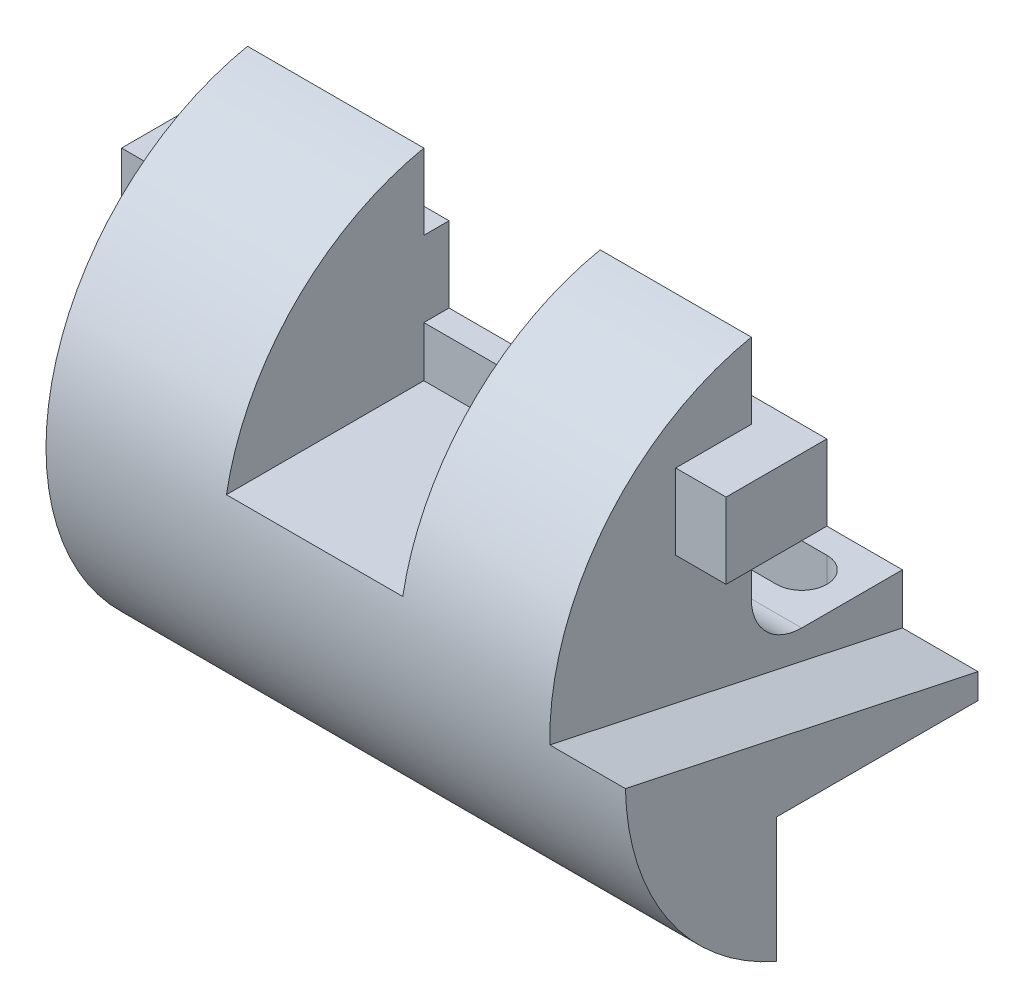
ISO-10303-21;
HEADER;
FILE_DESCRIPTION(('STEP AP214'),'2;1');
FILE_NAME('part.step','',(''),(''),'','','');
FILE_SCHEMA(('AUTOMOTIVE_DESIGN { 1 0 10303 214 1 1 1 1 }'));
ENDSEC;
DATA;
#1=APPLICATION_CONTEXT('core data for automotive mechanical design processes');
#2=APPLICATION_PROTOCOL_DEFINITION('international standard','automotive_design',2000,#1);
#3=PRODUCT_CONTEXT('',#1,'mechanical');
#4=PRODUCT('Part','Part','',(#3));
#5=PRODUCT_RELATED_PRODUCT_CATEGORY('part','',(#4));
#6=PRODUCT_DEFINITION_FORMATION('','',#4);
#7=PRODUCT_DEFINITION_CONTEXT('part definition',#1,'design');
#8=PRODUCT_DEFINITION('design','',#6,#7);
#9=PRODUCT_DEFINITION_SHAPE('','',#8);
#10=(LENGTH_UNIT() NAMED_UNIT(*) SI_UNIT(.MILLI.,.METRE.));
#11=(NAMED_UNIT(*) PLANE_ANGLE_UNIT() SI_UNIT($,.RADIAN.));
#12=(NAMED_UNIT(*) SI_UNIT($,.STERADIAN.) SOLID_ANGLE_UNIT());
#13=UNCERTAINTY_MEASURE_WITH_UNIT(LENGTH_MEASURE(1.E-05),#10,'distance_accuracy_value','');
#14=(GEOMETRIC_REPRESENTATION_CONTEXT(3) GLOBAL_UNCERTAINTY_ASSIGNED_CONTEXT((#13)) GLOBAL_UNIT_ASSIGNED_CONTEXT((#10,
#11,#12)) REPRESENTATION_CONTEXT('',''));
#15=CARTESIAN_POINT('',(0.,0.,0.));
#16=DIRECTION('',(0.,0.,1.));
#17=DIRECTION('',(1.,0.,0.));
#18=AXIS2_PLACEMENT_3D('',#15,#16,#17);
#19=CARTESIAN_POINT('',(115.,48.9897948556636,10.));
#20=DIRECTION('',(0.,0.,1.));
#21=DIRECTION('',(0.,-1.,0.));
#22=AXIS2_PLACEMENT_3D('',#19,#20,#21);
#23=PLANE('',#22);
#24=DIRECTION('',(0.,-1.,0.));
#25=VECTOR('',#24,1.);
#26=CARTESIAN_POINT('',(70.,48.9897948556636,10.));
#27=LINE('',#26,#25);
#28=CARTESIAN_POINT('',(70.,18.9897948556636,9.99999999999999));
#29=VERTEX_POINT('',#28);
#30=CARTESIAN_POINT('',(70.,8.98979485566356,9.99999999999999));
#31=VERTEX_POINT('',#30);
#32=EDGE_CURVE('E319',#29,#31,#27,.T.);
#33=ORIENTED_EDGE('',*,*,#32,.F.);
#34=DIRECTION('',(1.,0.,0.));
#35=VECTOR('',#34,1.);
#36=CARTESIAN_POINT('',(115.,18.9897948556636,10.));
#37=LINE('',#36,#35);
#38=CARTESIAN_POINT('',(100.,18.9897948556636,9.99999999999999));
#39=VERTEX_POINT('',#38);
#40=EDGE_CURVE('E279',#29,#39,#37,.T.);
#41=ORIENTED_EDGE('',*,*,#40,.T.);
#42=DIRECTION('',(0.,1.,0.));
#43=VECTOR('',#42,1.);
#44=CARTESIAN_POINT('',(100.,48.9897948556636,10.));
#45=LINE('',#44,#43);
#46=CARTESIAN_POINT('',(100.,3.98979485566356,9.99999999999999));
#47=VERTEX_POINT('',#46);
#48=EDGE_CURVE('E382',#47,#39,#45,.T.);
#49=ORIENTED_EDGE('',*,*,#48,.F.);
#50=DIRECTION('',(-1.,0.,0.));
#51=VECTOR('',#50,1.);
#52=CARTESIAN_POINT('',(115.,3.98979485566356,9.99999999999999));
#53=LINE('',#52,#51);
#54=CARTESIAN_POINT('',(0.,3.98979485566356,9.99999999999999));
#55=VERTEX_POINT('',#54);
#56=EDGE_CURVE('E429',#47,#55,#53,.T.);
#57=ORIENTED_EDGE('',*,*,#56,.T.);
#58=DIRECTION('',(0.,1.,0.));
#59=VECTOR('',#58,1.);
#60=CARTESIAN_POINT('',(0.,48.9897948556636,10.));
#61=LINE('',#60,#59);
#62=CARTESIAN_POINT('',(0.,18.9897948556636,10.));
#63=VERTEX_POINT('',#62);
#64=EDGE_CURVE('E400',#55,#63,#61,.T.);
#65=ORIENTED_EDGE('',*,*,#64,.T.);
#66=DIRECTION('',(-1.,0.,0.));
#67=VECTOR('',#66,1.);
#68=CARTESIAN_POINT('',(35.,18.9897948556636,10.));
#69=LINE('',#68,#67);
#70=CARTESIAN_POINT('',(35.,18.9897948556636,10.));
#71=VERTEX_POINT('',#70);
#72=EDGE_CURVE('E304',#71,#63,#69,.T.);
#73=ORIENTED_EDGE('',*,*,#72,.F.);
#74=DIRECTION('',(0.,1.,0.));
#75=VECTOR('',#74,1.);
#76=CARTESIAN_POINT('',(35.,48.9897948556636,10.));
#77=LINE('',#76,#75);
#78=CARTESIAN_POINT('',(35.,8.98979485566356,10.));
#79=VERTEX_POINT('',#78);
#80=EDGE_CURVE('E325',#79,#71,#77,.T.);
#81=ORIENTED_EDGE('',*,*,#80,.F.);
#82=DIRECTION('',(-1.,0.,0.));
#83=VECTOR('',#82,1.);
#84=CARTESIAN_POINT('',(70.,8.98979485566356,10.));
#85=LINE('',#84,#83);
#86=EDGE_CURVE('E321',#31,#79,#85,.T.);
#87=ORIENTED_EDGE('',*,*,#86,.F.);
#88=EDGE_LOOP('',(#33,#41,#49,#57,#65,#73,#81,#87));
#89=FACE_BOUND('',#88,.T.);
#90=ADVANCED_FACE('F41',(#89),#23,.F.);
#91=CARTESIAN_POINT('',(0.,0.,0.));
#92=DIRECTION('',(1.,0.,0.));
#93=DIRECTION('',(0.,0.,-1.));
#94=AXIS2_PLACEMENT_3D('',#91,#92,#93);
#95=PLANE('',#94);
#96=DIRECTION('',(0.,0.,1.));
#97=VECTOR('',#96,1.);
#98=CARTESIAN_POINT('',(0.,18.9897948556636,10.));
#99=LINE('',#98,#97);
#100=CARTESIAN_POINT('',(0.,18.9897948556636,25.));
#101=VERTEX_POINT('',#100);
#102=EDGE_CURVE('E285',#63,#101,#99,.T.);
#103=ORIENTED_EDGE('',*,*,#102,.F.);
#104=ORIENTED_EDGE('',*,*,#64,.F.);
#105=CARTESIAN_POINT('',(0.,3.98979485566356,0.));
#106=DIRECTION('',(-1.,0.,0.));
#107=DIRECTION('',(0.,0.,1.));
#108=AXIS2_PLACEMENT_3D('',#105,#106,#107);
#109=CIRCLE('',#108,10.);
#110=CARTESIAN_POINT('',(0.,-6.01020514433644,0.));
#111=VERTEX_POINT('',#110);
#112=EDGE_CURVE('E420',#111,#55,#109,.T.);
#113=ORIENTED_EDGE('',*,*,#112,.F.);
#114=DIRECTION('',(0.,0.,1.));
#115=VECTOR('',#114,1.);
#116=CARTESIAN_POINT('',(0.,-6.01020514433644,0.));
#117=LINE('',#116,#115);
#118=CARTESIAN_POINT('',(0.,-6.01020514433644,-20.));
#119=VERTEX_POINT('',#118);
#120=EDGE_CURVE('E417',#119,#111,#117,.T.);
#121=ORIENTED_EDGE('',*,*,#120,.F.);
#122=DIRECTION('',(0.,1.,0.));
#123=VECTOR('',#122,1.);
#124=CARTESIAN_POINT('',(0.,-6.01020514433644,-20.));
#125=LINE('',#124,#123);
#126=CARTESIAN_POINT('',(0.,-21.0102051443364,-20.));
#127=VERTEX_POINT('',#126);
#128=EDGE_CURVE('E414',#127,#119,#125,.T.);
#129=ORIENTED_EDGE('',*,*,#128,.F.);
#130=DIRECTION('',(0.,0.,-1.));
#131=VECTOR('',#130,1.);
#132=CARTESIAN_POINT('',(0.,-21.0102051443364,-20.));
#133=LINE('',#132,#131);
#134=CARTESIAN_POINT('',(0.,-21.0102051443364,20.));
#135=VERTEX_POINT('',#134);
#136=EDGE_CURVE('E412',#135,#127,#133,.T.);
#137=ORIENTED_EDGE('',*,*,#136,.F.);
#138=DIRECTION('',(0.,1.,0.));
#139=VECTOR('',#138,1.);
#140=CARTESIAN_POINT('',(0.,-21.0102051443364,20.));
#141=LINE('',#140,#139);
#142=CARTESIAN_POINT('',(0.,-45.8257569495584,20.));
#143=VERTEX_POINT('',#142);
#144=EDGE_CURVE('E410',#143,#135,#141,.T.);
#145=ORIENTED_EDGE('',*,*,#144,.F.);
#146=CARTESIAN_POINT('',(0.,0.,0.));
#147=DIRECTION('',(1.,0.,0.));
#148=DIRECTION('',(0.,0.,-1.));
#149=AXIS2_PLACEMENT_3D('',#146,#147,#148);
#150=CIRCLE('',#149,50.);
#151=CARTESIAN_POINT('',(0.,48.9897948556636,10.));
#152=VERTEX_POINT('',#151);
#153=EDGE_CURVE('E395',#152,#143,#150,.T.);
#154=ORIENTED_EDGE('',*,*,#153,.F.);
#155=CARTESIAN_POINT('',(0.,33.9897948556636,10.));
#156=VERTEX_POINT('',#155);
#157=EDGE_CURVE('E423',#156,#152,#61,.T.);
#158=ORIENTED_EDGE('',*,*,#157,.F.);
#159=DIRECTION('',(0.,0.,-1.));
#160=VECTOR('',#159,1.);
#161=CARTESIAN_POINT('',(0.,33.9897948556636,10.));
#162=LINE('',#161,#160);
#163=CARTESIAN_POINT('',(0.,33.9897948556636,25.));
#164=VERTEX_POINT('',#163);
#165=EDGE_CURVE('E289',#164,#156,#162,.T.);
#166=ORIENTED_EDGE('',*,*,#165,.F.);
#167=DIRECTION('',(0.,1.,0.));
#168=VECTOR('',#167,1.);
#169=CARTESIAN_POINT('',(0.,33.9897948556636,25.));
#170=LINE('',#169,#168);
#171=EDGE_CURVE('E296',#101,#164,#170,.T.);
#172=ORIENTED_EDGE('',*,*,#171,.F.);
#173=EDGE_LOOP('',(#103,#104,#113,#121,#129,#137,#145,#154,#158,#166,#172));
#174=FACE_BOUND('',#173,.T.);
#175=ADVANCED_FACE('F448',(#174),#95,.F.);
#176=CARTESIAN_POINT('',(100.,33.9897948556636,9.99999999999999));
#177=VERTEX_POINT('',#176);
#178=CARTESIAN_POINT('',(100.,48.9897948556636,9.99999999999999));
#179=VERTEX_POINT('',#178);
#180=EDGE_CURVE('E381',#177,#179,#45,.T.);
#181=ORIENTED_EDGE('',*,*,#180,.F.);
#182=DIRECTION('',(-1.,0.,0.));
#183=VECTOR('',#182,1.);
#184=CARTESIAN_POINT('',(115.,33.9897948556636,10.));
#185=LINE('',#184,#183);
#186=CARTESIAN_POINT('',(70.,33.9897948556636,9.99999999999999));
#187=VERTEX_POINT('',#186);
#188=EDGE_CURVE('E274',#177,#187,#185,.T.);
#189=ORIENTED_EDGE('',*,*,#188,.T.);
#190=CARTESIAN_POINT('',(70.,48.9897948556636,10.));
#191=VERTEX_POINT('',#190);
#192=EDGE_CURVE('E234',#191,#187,#27,.T.);
#193=ORIENTED_EDGE('',*,*,#192,.F.);
#194=DIRECTION('',(-1.,0.,0.));
#195=VECTOR('',#194,1.);
#196=CARTESIAN_POINT('',(115.,48.9897948556636,10.));
#197=LINE('',#196,#195);
#198=EDGE_CURVE('E426',#179,#191,#197,.T.);
#199=ORIENTED_EDGE('',*,*,#198,.F.);
#200=EDGE_LOOP('',(#181,#189,#193,#199));
#201=FACE_BOUND('',#200,.T.);
#202=ADVANCED_FACE('F508',(#201),#23,.F.);
#203=DIRECTION('',(1.,0.,0.));
#204=VECTOR('',#203,1.);
#205=CARTESIAN_POINT('',(35.,33.9897948556636,10.));
#206=LINE('',#205,#204);
#207=CARTESIAN_POINT('',(35.,33.9897948556636,10.));
#208=VERTEX_POINT('',#207);
#209=EDGE_CURVE('E309',#156,#208,#206,.T.);
#210=ORIENTED_EDGE('',*,*,#209,.F.);
#211=ORIENTED_EDGE('',*,*,#157,.T.);
#212=CARTESIAN_POINT('',(35.,48.9897948556636,10.));
#213=VERTEX_POINT('',#212);
#214=EDGE_CURVE('E407',#213,#152,#197,.T.);
#215=ORIENTED_EDGE('',*,*,#214,.F.);
#216=EDGE_CURVE('E324',#208,#213,#77,.T.);
#217=ORIENTED_EDGE('',*,*,#216,.F.);
#218=EDGE_LOOP('',(#210,#211,#215,#217));
#219=FACE_BOUND('',#218,.T.);
#220=ADVANCED_FACE('F472',(#219),#23,.F.);
#221=CARTESIAN_POINT('',(115.,0.,0.));
#222=DIRECTION('',(-1.,0.,0.));
#223=DIRECTION('',(0.,0.,1.));
#224=AXIS2_PLACEMENT_3D('',#221,#222,#223);
#225=CYLINDRICAL_SURFACE('',#224,50.);
#226=ORIENTED_EDGE('',*,*,#198,.T.);
#227=CARTESIAN_POINT('',(70.,0.,0.));
#228=DIRECTION('',(1.,0.,0.));
#229=DIRECTION('',(0.,0.,-1.));
#230=AXIS2_PLACEMENT_3D('',#227,#228,#229);
#231=CIRCLE('',#230,50.);
#232=CARTESIAN_POINT('',(70.,8.98979485566356,49.1851968426791));
#233=VERTEX_POINT('',#232);
#234=EDGE_CURVE('E339',#191,#233,#231,.T.);
#235=ORIENTED_EDGE('',*,*,#234,.T.);
#236=DIRECTION('',(-1.,0.,0.));
#237=VECTOR('',#236,1.);
#238=CARTESIAN_POINT('',(115.,8.98979485566356,49.1851968426791));
#239=LINE('',#238,#237);
#240=CARTESIAN_POINT('',(35.,8.98979485566356,49.1851968426791));
#241=VERTEX_POINT('',#240);
#242=EDGE_CURVE('E331',#233,#241,#239,.T.);
#243=ORIENTED_EDGE('',*,*,#242,.T.);
#244=CARTESIAN_POINT('',(35.,0.,0.));
#245=DIRECTION('',(-1.,0.,0.));
#246=DIRECTION('',(0.,-1.,0.));
#247=AXIS2_PLACEMENT_3D('',#244,#245,#246);
#248=CIRCLE('',#247,50.);
#249=EDGE_CURVE('E336',#241,#213,#248,.T.);
#250=ORIENTED_EDGE('',*,*,#249,.T.);
#251=ORIENTED_EDGE('',*,*,#214,.T.);
#252=ORIENTED_EDGE('',*,*,#153,.T.);
#253=DIRECTION('',(-1.,0.,0.));
#254=VECTOR('',#253,1.);
#255=CARTESIAN_POINT('',(115.,-45.8257569495584,20.));
#256=LINE('',#255,#254);
#257=CARTESIAN_POINT('',(115.,-45.8257569495584,20.));
#258=VERTEX_POINT('',#257);
#259=EDGE_CURVE('E11',#258,#143,#256,.T.);
#260=ORIENTED_EDGE('',*,*,#259,.F.);
#261=CARTESIAN_POINT('',(115.,0.,0.));
#262=DIRECTION('',(1.,0.,0.));
#263=DIRECTION('',(0.,0.,-1.));
#264=AXIS2_PLACEMENT_3D('',#261,#262,#263);
#265=CIRCLE('',#264,50.);
#266=CARTESIAN_POINT('',(115.,-1.13397946386005,49.987139251767));
#267=VERTEX_POINT('',#266);
#268=EDGE_CURVE('E397',#267,#258,#265,.T.);
#269=ORIENTED_EDGE('',*,*,#268,.F.);
#270=DIRECTION('',(1.,0.,0.));
#271=VECTOR('',#270,1.);
#272=CARTESIAN_POINT('',(100.,-1.13397946386005,49.987139251767));
#273=LINE('',#272,#271);
#274=CARTESIAN_POINT('',(100.,-1.13397946386005,49.987139251767));
#275=VERTEX_POINT('',#274);
#276=EDGE_CURVE('E390',#275,#267,#273,.T.);
#277=ORIENTED_EDGE('',*,*,#276,.F.);
#278=CARTESIAN_POINT('',(100.,-1.41830991395864E-11,-1.77843850757142E-11));
#279=DIRECTION('',(1.,0.,0.));
#280=DIRECTION('',(0.,0.,1.));
#281=AXIS2_PLACEMENT_3D('',#278,#279,#280);
#282=CIRCLE('',#281,50.0000000000175);
#283=EDGE_CURVE('E385',#179,#275,#282,.T.);
#284=ORIENTED_EDGE('',*,*,#283,.F.);
#285=EDGE_LOOP('',(#226,#235,#243,#250,#251,#252,#260,#269,#277,#284));
#286=FACE_BOUND('',#285,.T.);
#287=ADVANCED_FACE('F43',(#286),#225,.T.);
#288=CARTESIAN_POINT('',(115.,-21.0102051443364,20.));
#289=DIRECTION('',(0.,0.,1.));
#290=DIRECTION('',(0.,-1.,0.));
#291=AXIS2_PLACEMENT_3D('',#288,#289,#290);
#292=PLANE('',#291);
#293=ORIENTED_EDGE('',*,*,#144,.T.);
#294=DIRECTION('',(-1.,0.,0.));
#295=VECTOR('',#294,1.);
#296=CARTESIAN_POINT('',(115.,-21.0102051443364,20.));
#297=LINE('',#296,#295);
#298=CARTESIAN_POINT('',(115.,-21.0102051443364,20.));
#299=VERTEX_POINT('',#298);
#300=EDGE_CURVE('E49',#299,#135,#297,.T.);
#301=ORIENTED_EDGE('',*,*,#300,.F.);
#302=DIRECTION('',(0.,1.,0.));
#303=VECTOR('',#302,1.);
#304=CARTESIAN_POINT('',(115.,-21.0102051443364,20.));
#305=LINE('',#304,#303);
#306=EDGE_CURVE('E399',#258,#299,#305,.T.);
#307=ORIENTED_EDGE('',*,*,#306,.F.);
#308=ORIENTED_EDGE('',*,*,#259,.T.);
#309=EDGE_LOOP('',(#293,#301,#307,#308));
#310=FACE_BOUND('',#309,.T.);
#311=ADVANCED_FACE('F462',(#310),#292,.F.);
#312=CARTESIAN_POINT('',(115.,-21.0102051443364,-20.));
#313=DIRECTION('',(0.,1.,0.));
#314=DIRECTION('',(0.,0.,1.));
#315=AXIS2_PLACEMENT_3D('',#312,#313,#314);
#316=PLANE('',#315);
#317=DIRECTION('',(-1.,0.,0.));
#318=VECTOR('',#317,1.);
#319=CARTESIAN_POINT('',(115.,-21.0102051443364,-15.));
#320=LINE('',#319,#318);
#321=CARTESIAN_POINT('',(90.,-21.0102051443364,-15.));
#322=VERTEX_POINT('',#321);
#323=CARTESIAN_POINT('',(10.,-21.0102051443364,-15.));
#324=VERTEX_POINT('',#323);
#325=EDGE_CURVE('E368',#322,#324,#320,.T.);
#326=ORIENTED_EDGE('',*,*,#325,.T.);
#327=CARTESIAN_POINT('',(10.,-21.0102051443364,-10.));
#328=DIRECTION('',(0.,1.,0.));
#329=DIRECTION('',(0.,0.,1.));
#330=AXIS2_PLACEMENT_3D('',#327,#328,#329);
#331=CIRCLE('',#330,5.);
#332=CARTESIAN_POINT('',(10.,-21.0102051443364,-5.));
#333=VERTEX_POINT('',#332);
#334=EDGE_CURVE('E371',#324,#333,#331,.T.);
#335=ORIENTED_EDGE('',*,*,#334,.T.);
#336=DIRECTION('',(1.,0.,0.));
#337=VECTOR('',#336,1.);
#338=CARTESIAN_POINT('',(115.,-21.0102051443364,-5.));
#339=LINE('',#338,#337);
#340=CARTESIAN_POINT('',(90.,-21.0102051443364,-5.));
#341=VERTEX_POINT('',#340);
#342=EDGE_CURVE('E356',#333,#341,#339,.T.);
#343=ORIENTED_EDGE('',*,*,#342,.T.);
#344=CARTESIAN_POINT('',(90.,-21.0102051443364,-10.));
#345=DIRECTION('',(0.,1.,0.));
#346=DIRECTION('',(0.,0.,1.));
#347=AXIS2_PLACEMENT_3D('',#344,#345,#346);
#348=CIRCLE('',#347,5.);
#349=EDGE_CURVE('E365',#341,#322,#348,.T.);
#350=ORIENTED_EDGE('',*,*,#349,.T.);
#351=EDGE_LOOP('',(#326,#335,#343,#350));
#352=FACE_BOUND('',#351,.T.);
#353=ORIENTED_EDGE('',*,*,#136,.T.);
#354=DIRECTION('',(-1.,0.,0.));
#355=VECTOR('',#354,1.);
#356=CARTESIAN_POINT('',(115.,-21.0102051443364,-20.));
#357=LINE('',#356,#355);
#358=CARTESIAN_POINT('',(115.,-21.0102051443364,-20.));
#359=VERTEX_POINT('',#358);
#360=EDGE_CURVE('E435',#359,#127,#357,.T.);
#361=ORIENTED_EDGE('',*,*,#360,.F.);
#362=DIRECTION('',(0.,0.,-1.));
#363=VECTOR('',#362,1.);
#364=CARTESIAN_POINT('',(115.,-21.0102051443364,-20.));
#365=LINE('',#364,#363);
#366=EDGE_CURVE('E402',#299,#359,#365,.T.);
#367=ORIENTED_EDGE('',*,*,#366,.F.);
#368=ORIENTED_EDGE('',*,*,#300,.T.);
#369=EDGE_LOOP('',(#353,#361,#367,#368));
#370=FACE_BOUND('',#369,.T.);
#371=ADVANCED_FACE('F442',(#352,#370),#316,.F.);
#372=CARTESIAN_POINT('',(115.,-6.01020514433644,-20.));
#373=DIRECTION('',(0.,0.,1.));
#374=DIRECTION('',(0.,-1.,0.));
#375=AXIS2_PLACEMENT_3D('',#372,#373,#374);
#376=PLANE('',#375);
#377=DIRECTION('',(0.,1.,0.));
#378=VECTOR('',#377,1.);
#379=CARTESIAN_POINT('',(100.,-6.01020514433644,-20.));
#380=LINE('',#379,#378);
#381=CARTESIAN_POINT('',(100.,-16.0102051443364,-20.));
#382=VERTEX_POINT('',#381);
#383=CARTESIAN_POINT('',(100.,-6.01020514433644,-20.));
#384=VERTEX_POINT('',#383);
#385=EDGE_CURVE('E375',#382,#384,#380,.T.);
#386=ORIENTED_EDGE('',*,*,#385,.F.);
#387=DIRECTION('',(1.,0.,0.));
#388=VECTOR('',#387,1.);
#389=CARTESIAN_POINT('',(100.,-16.0102051443364,-20.));
#390=LINE('',#389,#388);
#391=CARTESIAN_POINT('',(115.,-16.0102051443364,-20.));
#392=VERTEX_POINT('',#391);
#393=EDGE_CURVE('E392',#382,#392,#390,.T.);
#394=ORIENTED_EDGE('',*,*,#393,.T.);
#395=DIRECTION('',(0.,1.,0.));
#396=VECTOR('',#395,1.);
#397=CARTESIAN_POINT('',(115.,-6.01020514433644,-20.));
#398=LINE('',#397,#396);
#399=EDGE_CURVE('E404',#359,#392,#398,.T.);
#400=ORIENTED_EDGE('',*,*,#399,.F.);
#401=ORIENTED_EDGE('',*,*,#360,.T.);
#402=ORIENTED_EDGE('',*,*,#128,.T.);
#403=DIRECTION('',(-1.,0.,0.));
#404=VECTOR('',#403,1.);
#405=CARTESIAN_POINT('',(115.,-6.01020514433644,-20.));
#406=LINE('',#405,#404);
#407=EDGE_CURVE('E433',#384,#119,#406,.T.);
#408=ORIENTED_EDGE('',*,*,#407,.F.);
#409=EDGE_LOOP('',(#386,#394,#400,#401,#402,#408));
#410=FACE_BOUND('',#409,.T.);
#411=ADVANCED_FACE('F455',(#410),#376,.F.);
#412=CARTESIAN_POINT('',(115.,-6.01020514433644,0.));
#413=DIRECTION('',(0.,-1.,0.));
#414=DIRECTION('',(0.,0.,-1.));
#415=AXIS2_PLACEMENT_3D('',#412,#413,#414);
#416=PLANE('',#415);
#417=DIRECTION('',(1.,0.,0.));
#418=VECTOR('',#417,1.);
#419=CARTESIAN_POINT('',(10.,-6.01020514433644,-5.));
#420=LINE('',#419,#418);
#421=CARTESIAN_POINT('',(10.,-6.01020514433644,-5.));
#422=VERTEX_POINT('',#421);
#423=CARTESIAN_POINT('',(90.,-6.01020514433644,-5.));
#424=VERTEX_POINT('',#423);
#425=EDGE_CURVE('E344',#422,#424,#420,.T.);
#426=ORIENTED_EDGE('',*,*,#425,.F.);
#427=CARTESIAN_POINT('',(10.,-6.01020514433644,-10.));
#428=DIRECTION('',(0.,1.,0.));
#429=DIRECTION('',(0.,0.,1.));
#430=AXIS2_PLACEMENT_3D('',#427,#428,#429);
#431=CIRCLE('',#430,5.);
#432=CARTESIAN_POINT('',(10.,-6.01020514433644,-15.));
#433=VERTEX_POINT('',#432);
#434=EDGE_CURVE('E342',#433,#422,#431,.T.);
#435=ORIENTED_EDGE('',*,*,#434,.F.);
#436=DIRECTION('',(-1.,0.,0.));
#437=VECTOR('',#436,1.);
#438=CARTESIAN_POINT('',(10.,-6.01020514433644,-15.));
#439=LINE('',#438,#437);
#440=CARTESIAN_POINT('',(90.,-6.01020514433644,-15.));
#441=VERTEX_POINT('',#440);
#442=EDGE_CURVE('E350',#441,#433,#439,.T.);
#443=ORIENTED_EDGE('',*,*,#442,.F.);
#444=CARTESIAN_POINT('',(90.,-6.01020514433644,-10.));
#445=DIRECTION('',(0.,1.,0.));
#446=DIRECTION('',(0.,0.,1.));
#447=AXIS2_PLACEMENT_3D('',#444,#445,#446);
#448=CIRCLE('',#447,5.);
#449=EDGE_CURVE('E347',#424,#441,#448,.T.);
#450=ORIENTED_EDGE('',*,*,#449,.F.);
#451=EDGE_LOOP('',(#426,#435,#443,#450));
#452=FACE_BOUND('',#451,.T.);
#453=DIRECTION('',(-1.,0.,0.));
#454=VECTOR('',#453,1.);
#455=CARTESIAN_POINT('',(115.,-6.01020514433644,0.));
#456=LINE('',#455,#454);
#457=CARTESIAN_POINT('',(100.,-6.01020514433644,0.));
#458=VERTEX_POINT('',#457);
#459=EDGE_CURVE('E431',#458,#111,#456,.T.);
#460=ORIENTED_EDGE('',*,*,#459,.F.);
#461=DIRECTION('',(0.,0.,1.));
#462=VECTOR('',#461,1.);
#463=CARTESIAN_POINT('',(100.,-6.01020514433644,0.));
#464=LINE('',#463,#462);
#465=EDGE_CURVE('E377',#384,#458,#464,.T.);
#466=ORIENTED_EDGE('',*,*,#465,.F.);
#467=ORIENTED_EDGE('',*,*,#407,.T.);
#468=ORIENTED_EDGE('',*,*,#120,.T.);
#469=EDGE_LOOP('',(#460,#466,#467,#468));
#470=FACE_BOUND('',#469,.T.);
#471=ADVANCED_FACE('F498',(#452,#470),#416,.F.);
#472=CARTESIAN_POINT('',(115.,3.98979485566356,0.));
#473=DIRECTION('',(-1.,0.,0.));
#474=DIRECTION('',(0.,0.,1.));
#475=AXIS2_PLACEMENT_3D('',#472,#473,#474);
#476=CYLINDRICAL_SURFACE('',#475,10.);
#477=ORIENTED_EDGE('',*,*,#56,.F.);
#478=CARTESIAN_POINT('',(100.,3.98979485566356,0.));
#479=DIRECTION('',(-1.,0.,0.));
#480=DIRECTION('',(0.,0.,-1.));
#481=AXIS2_PLACEMENT_3D('',#478,#479,#480);
#482=CIRCLE('',#481,10.);
#483=EDGE_CURVE('E379',#458,#47,#482,.T.);
#484=ORIENTED_EDGE('',*,*,#483,.F.);
#485=ORIENTED_EDGE('',*,*,#459,.T.);
#486=ORIENTED_EDGE('',*,*,#112,.T.);
#487=EDGE_LOOP('',(#477,#484,#485,#486));
#488=FACE_BOUND('',#487,.T.);
#489=ADVANCED_FACE('F494',(#488),#476,.F.);
#490=CARTESIAN_POINT('',(115.,0.,0.));
#491=DIRECTION('',(1.,0.,0.));
#492=DIRECTION('',(0.,0.,-1.));
#493=AXIS2_PLACEMENT_3D('',#490,#491,#492);
#494=PLANE('',#493);
#495=DIRECTION('',(0.,-0.207911690817756,-0.978147600733806));
#496=VECTOR('',#495,1.);
#497=CARTESIAN_POINT('',(115.,-16.0102051443364,-20.));
#498=LINE('',#497,#496);
#499=EDGE_CURVE('E374',#267,#392,#498,.T.);
#500=ORIENTED_EDGE('',*,*,#499,.F.);
#501=ORIENTED_EDGE('',*,*,#268,.T.);
#502=ORIENTED_EDGE('',*,*,#306,.T.);
#503=ORIENTED_EDGE('',*,*,#366,.T.);
#504=ORIENTED_EDGE('',*,*,#399,.T.);
#505=EDGE_LOOP('',(#500,#501,#502,#503,#504));
#506=FACE_BOUND('',#505,.T.);
#507=ADVANCED_FACE('F459',(#506),#494,.T.);
#508=CARTESIAN_POINT('',(100.,-16.0102051443364,-20.));
#509=DIRECTION('',(0.,-0.978147600733806,0.207911690817756));
#510=DIRECTION('',(0.,-0.207911690817756,-0.978147600733806));
#511=AXIS2_PLACEMENT_3D('',#508,#509,#510);
#512=PLANE('',#511);
#513=ORIENTED_EDGE('',*,*,#499,.T.);
#514=ORIENTED_EDGE('',*,*,#393,.F.);
#515=DIRECTION('',(0.,-0.207911690817756,-0.978147600733806));
#516=VECTOR('',#515,1.);
#517=CARTESIAN_POINT('',(100.,-16.0102051443364,-20.));
#518=LINE('',#517,#516);
#519=EDGE_CURVE('E387',#275,#382,#518,.T.);
#520=ORIENTED_EDGE('',*,*,#519,.F.);
#521=ORIENTED_EDGE('',*,*,#276,.T.);
#522=EDGE_LOOP('',(#513,#514,#520,#521));
#523=FACE_BOUND('',#522,.T.);
#524=ADVANCED_FACE('F504',(#523),#512,.F.);
#525=CARTESIAN_POINT('',(100.,-1.41830991395864E-11,-1.77843850757142E-11));
#526=DIRECTION('',(-1.,0.,0.));
#527=DIRECTION('',(0.,0.,1.));
#528=AXIS2_PLACEMENT_3D('',#525,#526,#527);
#529=PLANE('',#528);
#530=ORIENTED_EDGE('',*,*,#48,.T.);
#531=DIRECTION('',(0.,0.,1.));
#532=VECTOR('',#531,1.);
#533=CARTESIAN_POINT('',(100.,18.9897948556636,-1.77820320726471E-11));
#534=LINE('',#533,#532);
#535=CARTESIAN_POINT('',(100.,18.9897948556636,25.));
#536=VERTEX_POINT('',#535);
#537=EDGE_CURVE('E276',#39,#536,#534,.T.);
#538=ORIENTED_EDGE('',*,*,#537,.T.);
#539=DIRECTION('',(0.,1.,0.));
#540=VECTOR('',#539,1.);
#541=CARTESIAN_POINT('',(100.,-1.41859903453797E-11,25.));
#542=LINE('',#541,#540);
#543=CARTESIAN_POINT('',(100.,33.9897948556636,25.));
#544=VERTEX_POINT('',#543);
#545=EDGE_CURVE('E265',#536,#544,#542,.T.);
#546=ORIENTED_EDGE('',*,*,#545,.T.);
#547=DIRECTION('',(0.,0.,-1.));
#548=VECTOR('',#547,1.);
#549=CARTESIAN_POINT('',(100.,33.9897948556636,-1.77801734403514E-11));
#550=LINE('',#549,#548);
#551=EDGE_CURVE('E271',#544,#177,#550,.T.);
#552=ORIENTED_EDGE('',*,*,#551,.T.);
#553=ORIENTED_EDGE('',*,*,#180,.T.);
#554=ORIENTED_EDGE('',*,*,#283,.T.);
#555=ORIENTED_EDGE('',*,*,#519,.T.);
#556=ORIENTED_EDGE('',*,*,#385,.T.);
#557=ORIENTED_EDGE('',*,*,#465,.T.);
#558=ORIENTED_EDGE('',*,*,#483,.T.);
#559=EDGE_LOOP('',(#530,#538,#546,#552,#553,#554,#555,#556,#557,#558));
#560=FACE_BOUND('',#559,.T.);
#561=ADVANCED_FACE('F500',(#560),#529,.F.);
#562=CARTESIAN_POINT('',(10.,-73.0102051443364,-9.99999999999999));
#563=DIRECTION('',(0.,1.,0.));
#564=DIRECTION('',(0.,0.,1.));
#565=AXIS2_PLACEMENT_3D('',#562,#563,#564);
#566=CYLINDRICAL_SURFACE('',#565,5.);
#567=DIRECTION('',(0.,1.,0.));
#568=VECTOR('',#567,1.);
#569=CARTESIAN_POINT('',(10.,-73.0102051443364,-15.));
#570=LINE('',#569,#568);
#571=EDGE_CURVE('E354',#324,#433,#570,.T.);
#572=ORIENTED_EDGE('',*,*,#571,.T.);
#573=ORIENTED_EDGE('',*,*,#434,.T.);
#574=DIRECTION('',(0.,1.,0.));
#575=VECTOR('',#574,1.);
#576=CARTESIAN_POINT('',(10.,-73.0102051443364,-4.99999999999999));
#577=LINE('',#576,#575);
#578=EDGE_CURVE('E353',#333,#422,#577,.T.);
#579=ORIENTED_EDGE('',*,*,#578,.F.);
#580=ORIENTED_EDGE('',*,*,#334,.F.);
#581=EDGE_LOOP('',(#572,#573,#579,#580));
#582=FACE_BOUND('',#581,.T.);
#583=ADVANCED_FACE('F599',(#582),#566,.F.);
#584=CARTESIAN_POINT('',(10.,-73.0102051443364,-15.));
#585=DIRECTION('',(0.,0.,-1.));
#586=DIRECTION('',(0.,1.,0.));
#587=AXIS2_PLACEMENT_3D('',#584,#585,#586);
#588=PLANE('',#587);
#589=DIRECTION('',(0.,1.,0.));
#590=VECTOR('',#589,1.);
#591=CARTESIAN_POINT('',(90.,-73.0102051443364,-15.));
#592=LINE('',#591,#590);
#593=EDGE_CURVE('E357',#322,#441,#592,.T.);
#594=ORIENTED_EDGE('',*,*,#593,.T.);
#595=ORIENTED_EDGE('',*,*,#442,.T.);
#596=ORIENTED_EDGE('',*,*,#571,.F.);
#597=ORIENTED_EDGE('',*,*,#325,.F.);
#598=EDGE_LOOP('',(#594,#595,#596,#597));
#599=FACE_BOUND('',#598,.T.);
#600=ADVANCED_FACE('F606',(#599),#588,.F.);
#601=CARTESIAN_POINT('',(90.,-73.0102051443364,-9.99999999999999));
#602=DIRECTION('',(0.,1.,0.));
#603=DIRECTION('',(0.,0.,1.));
#604=AXIS2_PLACEMENT_3D('',#601,#602,#603);
#605=CYLINDRICAL_SURFACE('',#604,5.);
#606=DIRECTION('',(0.,1.,0.));
#607=VECTOR('',#606,1.);
#608=CARTESIAN_POINT('',(90.,-73.0102051443364,-4.99999999999999));
#609=LINE('',#608,#607);
#610=EDGE_CURVE('E359',#341,#424,#609,.T.);
#611=ORIENTED_EDGE('',*,*,#610,.T.);
#612=ORIENTED_EDGE('',*,*,#449,.T.);
#613=ORIENTED_EDGE('',*,*,#593,.F.);
#614=ORIENTED_EDGE('',*,*,#349,.F.);
#615=EDGE_LOOP('',(#611,#612,#613,#614));
#616=FACE_BOUND('',#615,.T.);
#617=ADVANCED_FACE('F614',(#616),#605,.F.);
#618=CARTESIAN_POINT('',(10.,-73.0102051443364,-4.99999999999999));
#619=DIRECTION('',(0.,0.,1.));
#620=DIRECTION('',(0.,-1.,0.));
#621=AXIS2_PLACEMENT_3D('',#618,#619,#620);
#622=PLANE('',#621);
#623=ORIENTED_EDGE('',*,*,#578,.T.);
#624=ORIENTED_EDGE('',*,*,#425,.T.);
#625=ORIENTED_EDGE('',*,*,#610,.F.);
#626=ORIENTED_EDGE('',*,*,#342,.F.);
#627=EDGE_LOOP('',(#623,#624,#625,#626));
#628=FACE_BOUND('',#627,.T.);
#629=ADVANCED_FACE('F622',(#628),#622,.F.);
#630=CARTESIAN_POINT('',(70.,48.9897948556636,77.));
#631=DIRECTION('',(1.,0.,0.));
#632=DIRECTION('',(0.,0.,-1.));
#633=AXIS2_PLACEMENT_3D('',#630,#631,#632);
#634=PLANE('',#633);
#635=ORIENTED_EDGE('',*,*,#192,.T.);
#636=DIRECTION('',(0.,0.,-1.));
#637=VECTOR('',#636,1.);
#638=CARTESIAN_POINT('',(70.,33.9897948556636,25.));
#639=LINE('',#638,#637);
#640=CARTESIAN_POINT('',(70.,33.9897948556636,5.));
#641=VERTEX_POINT('',#640);
#642=EDGE_CURVE('E227',#187,#641,#639,.T.);
#643=ORIENTED_EDGE('',*,*,#642,.T.);
#644=DIRECTION('',(0.,1.,0.));
#645=VECTOR('',#644,1.);
#646=CARTESIAN_POINT('',(70.,33.9897948556636,5.));
#647=LINE('',#646,#645);
#648=CARTESIAN_POINT('',(70.,18.9897948556636,5.));
#649=VERTEX_POINT('',#648);
#650=EDGE_CURVE('E232',#649,#641,#647,.T.);
#651=ORIENTED_EDGE('',*,*,#650,.F.);
#652=DIRECTION('',(0.,0.,-1.));
#653=VECTOR('',#652,1.);
#654=CARTESIAN_POINT('',(70.,18.9897948556636,25.));
#655=LINE('',#654,#653);
#656=EDGE_CURVE('E263',#29,#649,#655,.T.);
#657=ORIENTED_EDGE('',*,*,#656,.F.);
#658=ORIENTED_EDGE('',*,*,#32,.T.);
#659=DIRECTION('',(0.,0.,-1.));
#660=VECTOR('',#659,1.);
#661=CARTESIAN_POINT('',(70.,8.98979485566355,77.));
#662=LINE('',#661,#660);
#663=EDGE_CURVE('E328',#233,#31,#662,.T.);
#664=ORIENTED_EDGE('',*,*,#663,.F.);
#665=ORIENTED_EDGE('',*,*,#234,.F.);
#666=EDGE_LOOP('',(#635,#643,#651,#657,#658,#664,#665));
#667=FACE_BOUND('',#666,.T.);
#668=ADVANCED_FACE('F229',(#667),#634,.F.);
#669=CARTESIAN_POINT('',(35.,48.9897948556636,77.));
#670=DIRECTION('',(-1.,0.,0.));
#671=DIRECTION('',(0.,-1.,0.));
#672=AXIS2_PLACEMENT_3D('',#669,#670,#671);
#673=PLANE('',#672);
#674=DIRECTION('',(0.,0.,-1.));
#675=VECTOR('',#674,1.);
#676=CARTESIAN_POINT('',(35.,8.98979485566355,77.));
#677=LINE('',#676,#675);
#678=EDGE_CURVE('E329',#241,#79,#677,.T.);
#679=ORIENTED_EDGE('',*,*,#678,.T.);
#680=ORIENTED_EDGE('',*,*,#80,.T.);
#681=DIRECTION('',(0.,0.,1.));
#682=VECTOR('',#681,1.);
#683=CARTESIAN_POINT('',(35.,18.9897948556636,5.));
#684=LINE('',#683,#682);
#685=CARTESIAN_POINT('',(35.,18.9897948556636,5.));
#686=VERTEX_POINT('',#685);
#687=EDGE_CURVE('E317',#686,#71,#684,.T.);
#688=ORIENTED_EDGE('',*,*,#687,.F.);
#689=DIRECTION('',(0.,-1.,0.));
#690=VECTOR('',#689,1.);
#691=CARTESIAN_POINT('',(35.,33.9897948556636,5.));
#692=LINE('',#691,#690);
#693=CARTESIAN_POINT('',(35.,33.9897948556636,5.));
#694=VERTEX_POINT('',#693);
#695=EDGE_CURVE('E305',#694,#686,#692,.T.);
#696=ORIENTED_EDGE('',*,*,#695,.F.);
#697=DIRECTION('',(0.,0.,1.));
#698=VECTOR('',#697,1.);
#699=CARTESIAN_POINT('',(35.,33.9897948556636,5.));
#700=LINE('',#699,#698);
#701=EDGE_CURVE('E64',#694,#208,#700,.T.);
#702=ORIENTED_EDGE('',*,*,#701,.T.);
#703=ORIENTED_EDGE('',*,*,#216,.T.);
#704=ORIENTED_EDGE('',*,*,#249,.F.);
#705=EDGE_LOOP('',(#679,#680,#688,#696,#702,#703,#704));
#706=FACE_BOUND('',#705,.T.);
#707=ADVANCED_FACE('F635',(#706),#673,.F.);
#708=CARTESIAN_POINT('',(70.,8.98979485566355,77.));
#709=DIRECTION('',(0.,-1.,0.));
#710=DIRECTION('',(0.,0.,-1.));
#711=AXIS2_PLACEMENT_3D('',#708,#709,#710);
#712=PLANE('',#711);
#713=ORIENTED_EDGE('',*,*,#663,.T.);
#714=ORIENTED_EDGE('',*,*,#86,.T.);
#715=ORIENTED_EDGE('',*,*,#678,.F.);
#716=ORIENTED_EDGE('',*,*,#242,.F.);
#717=EDGE_LOOP('',(#713,#714,#715,#716));
#718=FACE_BOUND('',#717,.T.);
#719=ADVANCED_FACE('F643',(#718),#712,.F.);
#720=CARTESIAN_POINT('',(35.,18.9897948556636,5.));
#721=DIRECTION('',(0.,1.,0.));
#722=DIRECTION('',(0.,0.,1.));
#723=AXIS2_PLACEMENT_3D('',#720,#721,#722);
#724=PLANE('',#723);
#725=ORIENTED_EDGE('',*,*,#72,.T.);
#726=ORIENTED_EDGE('',*,*,#102,.T.);
#727=DIRECTION('',(1.,0.,0.));
#728=VECTOR('',#727,1.);
#729=CARTESIAN_POINT('',(-10.,18.9897948556636,25.));
#730=LINE('',#729,#728);
#731=CARTESIAN_POINT('',(-10.,18.9897948556636,25.));
#732=VERTEX_POINT('',#731);
#733=EDGE_CURVE('E301',#732,#101,#730,.T.);
#734=ORIENTED_EDGE('',*,*,#733,.F.);
#735=DIRECTION('',(0.,0.,1.));
#736=VECTOR('',#735,1.);
#737=CARTESIAN_POINT('',(-10.,18.9897948556636,10.));
#738=LINE('',#737,#736);
#739=CARTESIAN_POINT('',(-10.,18.9897948556636,5.));
#740=VERTEX_POINT('',#739);
#741=EDGE_CURVE('E286',#740,#732,#738,.T.);
#742=ORIENTED_EDGE('',*,*,#741,.F.);
#743=DIRECTION('',(-1.,0.,0.));
#744=VECTOR('',#743,1.);
#745=CARTESIAN_POINT('',(35.,18.9897948556636,5.));
#746=LINE('',#745,#744);
#747=EDGE_CURVE('E308',#686,#740,#746,.T.);
#748=ORIENTED_EDGE('',*,*,#747,.F.);
#749=ORIENTED_EDGE('',*,*,#687,.T.);
#750=EDGE_LOOP('',(#725,#726,#734,#742,#748,#749));
#751=FACE_BOUND('',#750,.T.);
#752=ADVANCED_FACE('F485',(#751),#724,.F.);
#753=CARTESIAN_POINT('',(35.,33.9897948556636,5.));
#754=DIRECTION('',(0.,-1.,0.));
#755=DIRECTION('',(1.,0.,0.));
#756=AXIS2_PLACEMENT_3D('',#753,#754,#755);
#757=PLANE('',#756);
#758=DIRECTION('',(1.,0.,0.));
#759=VECTOR('',#758,1.);
#760=CARTESIAN_POINT('',(35.,33.9897948556636,5.));
#761=LINE('',#760,#759);
#762=CARTESIAN_POINT('',(-10.,33.9897948556636,5.));
#763=VERTEX_POINT('',#762);
#764=EDGE_CURVE('E311',#763,#694,#761,.T.);
#765=ORIENTED_EDGE('',*,*,#764,.F.);
#766=DIRECTION('',(0.,0.,-1.));
#767=VECTOR('',#766,1.);
#768=CARTESIAN_POINT('',(-10.,33.9897948556636,10.));
#769=LINE('',#768,#767);
#770=CARTESIAN_POINT('',(-10.,33.9897948556636,25.));
#771=VERTEX_POINT('',#770);
#772=EDGE_CURVE('E291',#771,#763,#769,.T.);
#773=ORIENTED_EDGE('',*,*,#772,.F.);
#774=DIRECTION('',(1.,0.,0.));
#775=VECTOR('',#774,1.);
#776=CARTESIAN_POINT('',(-10.,33.9897948556636,25.));
#777=LINE('',#776,#775);
#778=EDGE_CURVE('E294',#771,#164,#777,.T.);
#779=ORIENTED_EDGE('',*,*,#778,.T.);
#780=ORIENTED_EDGE('',*,*,#165,.T.);
#781=ORIENTED_EDGE('',*,*,#209,.T.);
#782=ORIENTED_EDGE('',*,*,#701,.F.);
#783=EDGE_LOOP('',(#765,#773,#779,#780,#781,#782));
#784=FACE_BOUND('',#783,.T.);
#785=ADVANCED_FACE('F475',(#784),#757,.F.);
#786=CARTESIAN_POINT('',(0.,0.,4.99999999999999));
#787=DIRECTION('',(0.,0.,-1.));
#788=DIRECTION('',(0.,1.,0.));
#789=AXIS2_PLACEMENT_3D('',#786,#787,#788);
#790=PLANE('',#789);
#791=ORIENTED_EDGE('',*,*,#695,.T.);
#792=ORIENTED_EDGE('',*,*,#747,.T.);
#793=DIRECTION('',(0.,1.,0.));
#794=VECTOR('',#793,1.);
#795=CARTESIAN_POINT('',(-10.,33.9897948556636,5.));
#796=LINE('',#795,#794);
#797=EDGE_CURVE('E282',#740,#763,#796,.T.);
#798=ORIENTED_EDGE('',*,*,#797,.T.);
#799=ORIENTED_EDGE('',*,*,#764,.T.);
#800=EDGE_LOOP('',(#791,#792,#798,#799));
#801=FACE_BOUND('',#800,.T.);
#802=ADVANCED_FACE('F662',(#801),#790,.T.);
#803=CARTESIAN_POINT('',(-10.,33.9897948556636,25.));
#804=DIRECTION('',(0.,0.,-1.));
#805=DIRECTION('',(0.,1.,0.));
#806=AXIS2_PLACEMENT_3D('',#803,#804,#805);
#807=PLANE('',#806);
#808=ORIENTED_EDGE('',*,*,#171,.T.);
#809=ORIENTED_EDGE('',*,*,#778,.F.);
#810=DIRECTION('',(0.,1.,0.));
#811=VECTOR('',#810,1.);
#812=CARTESIAN_POINT('',(-10.,33.9897948556636,25.));
#813=LINE('',#812,#811);
#814=EDGE_CURVE('E288',#732,#771,#813,.T.);
#815=ORIENTED_EDGE('',*,*,#814,.F.);
#816=ORIENTED_EDGE('',*,*,#733,.T.);
#817=EDGE_LOOP('',(#808,#809,#815,#816));
#818=FACE_BOUND('',#817,.T.);
#819=ADVANCED_FACE('F480',(#818),#807,.F.);
#820=CARTESIAN_POINT('',(-10.,0.,0.));
#821=DIRECTION('',(-1.,0.,0.));
#822=DIRECTION('',(0.,0.,1.));
#823=AXIS2_PLACEMENT_3D('',#820,#821,#822);
#824=PLANE('',#823);
#825=ORIENTED_EDGE('',*,*,#772,.T.);
#826=ORIENTED_EDGE('',*,*,#797,.F.);
#827=ORIENTED_EDGE('',*,*,#741,.T.);
#828=ORIENTED_EDGE('',*,*,#814,.T.);
#829=EDGE_LOOP('',(#825,#826,#827,#828));
#830=FACE_BOUND('',#829,.T.);
#831=ADVANCED_FACE('F676',(#830),#824,.T.);
#832=CARTESIAN_POINT('',(70.,18.9897948556636,25.));
#833=DIRECTION('',(0.,-1.,0.));
#834=DIRECTION('',(0.,0.,-1.));
#835=AXIS2_PLACEMENT_3D('',#832,#833,#834);
#836=PLANE('',#835);
#837=ORIENTED_EDGE('',*,*,#40,.F.);
#838=ORIENTED_EDGE('',*,*,#656,.T.);
#839=DIRECTION('',(-1.,0.,0.));
#840=VECTOR('',#839,1.);
#841=CARTESIAN_POINT('',(70.,18.9897948556636,5.));
#842=LINE('',#841,#840);
#843=CARTESIAN_POINT('',(110.,18.9897948556636,5.));
#844=VERTEX_POINT('',#843);
#845=EDGE_CURVE('E252',#844,#649,#842,.T.);
#846=ORIENTED_EDGE('',*,*,#845,.F.);
#847=DIRECTION('',(0.,0.,-1.));
#848=VECTOR('',#847,1.);
#849=CARTESIAN_POINT('',(110.,18.9897948556636,25.));
#850=LINE('',#849,#848);
#851=CARTESIAN_POINT('',(110.,18.9897948556636,25.));
#852=VERTEX_POINT('',#851);
#853=EDGE_CURVE('E266',#852,#844,#850,.T.);
#854=ORIENTED_EDGE('',*,*,#853,.F.);
#855=DIRECTION('',(-1.,0.,0.));
#856=VECTOR('',#855,1.);
#857=CARTESIAN_POINT('',(70.,18.9897948556636,25.));
#858=LINE('',#857,#856);
#859=EDGE_CURVE('E238',#852,#536,#858,.T.);
#860=ORIENTED_EDGE('',*,*,#859,.T.);
#861=ORIENTED_EDGE('',*,*,#537,.F.);
#862=EDGE_LOOP('',(#837,#838,#846,#854,#860,#861));
#863=FACE_BOUND('',#862,.T.);
#864=ADVANCED_FACE('F512',(#863),#836,.T.);
#865=CARTESIAN_POINT('',(70.,33.9897948556636,25.));
#866=DIRECTION('',(0.,1.,0.));
#867=DIRECTION('',(-1.,0.,0.));
#868=AXIS2_PLACEMENT_3D('',#865,#866,#867);
#869=PLANE('',#868);
#870=ORIENTED_EDGE('',*,*,#188,.F.);
#871=ORIENTED_EDGE('',*,*,#551,.F.);
#872=DIRECTION('',(1.,0.,0.));
#873=VECTOR('',#872,1.);
#874=CARTESIAN_POINT('',(70.,33.9897948556636,25.));
#875=LINE('',#874,#873);
#876=CARTESIAN_POINT('',(110.,33.9897948556636,25.));
#877=VERTEX_POINT('',#876);
#878=EDGE_CURVE('E56',#544,#877,#875,.T.);
#879=ORIENTED_EDGE('',*,*,#878,.T.);
#880=DIRECTION('',(0.,0.,-1.));
#881=VECTOR('',#880,1.);
#882=CARTESIAN_POINT('',(110.,33.9897948556636,25.));
#883=LINE('',#882,#881);
#884=CARTESIAN_POINT('',(110.,33.9897948556636,5.));
#885=VERTEX_POINT('',#884);
#886=EDGE_CURVE('E237',#877,#885,#883,.T.);
#887=ORIENTED_EDGE('',*,*,#886,.T.);
#888=DIRECTION('',(1.,0.,0.));
#889=VECTOR('',#888,1.);
#890=CARTESIAN_POINT('',(70.,33.9897948556636,5.));
#891=LINE('',#890,#889);
#892=EDGE_CURVE('E241',#641,#885,#891,.T.);
#893=ORIENTED_EDGE('',*,*,#892,.F.);
#894=ORIENTED_EDGE('',*,*,#642,.F.);
#895=EDGE_LOOP('',(#870,#871,#879,#887,#893,#894));
#896=FACE_BOUND('',#895,.T.);
#897=ADVANCED_FACE('F242',(#896),#869,.T.);
#898=CARTESIAN_POINT('',(0.,0.,25.));
#899=DIRECTION('',(0.,0.,1.));
#900=DIRECTION('',(0.,-1.,0.));
#901=AXIS2_PLACEMENT_3D('',#898,#899,#900);
#902=PLANE('',#901);
#903=ORIENTED_EDGE('',*,*,#545,.F.);
#904=ORIENTED_EDGE('',*,*,#859,.F.);
#905=DIRECTION('',(0.,-1.,0.));
#906=VECTOR('',#905,1.);
#907=CARTESIAN_POINT('',(110.,33.9897948556636,25.));
#908=LINE('',#907,#906);
#909=EDGE_CURVE('E258',#877,#852,#908,.T.);
#910=ORIENTED_EDGE('',*,*,#909,.F.);
#911=ORIENTED_EDGE('',*,*,#878,.F.);
#912=EDGE_LOOP('',(#903,#904,#910,#911));
#913=FACE_BOUND('',#912,.T.);
#914=ADVANCED_FACE('F510',(#913),#902,.T.);
#915=CARTESIAN_POINT('',(110.,33.9897948556636,25.));
#916=DIRECTION('',(1.,0.,0.));
#917=DIRECTION('',(0.,0.,-1.));
#918=AXIS2_PLACEMENT_3D('',#915,#916,#917);
#919=PLANE('',#918);
#920=ORIENTED_EDGE('',*,*,#853,.T.);
#921=DIRECTION('',(0.,-1.,0.));
#922=VECTOR('',#921,1.);
#923=CARTESIAN_POINT('',(110.,33.9897948556636,5.));
#924=LINE('',#923,#922);
#925=EDGE_CURVE('E247',#885,#844,#924,.T.);
#926=ORIENTED_EDGE('',*,*,#925,.F.);
#927=ORIENTED_EDGE('',*,*,#886,.F.);
#928=ORIENTED_EDGE('',*,*,#909,.T.);
#929=EDGE_LOOP('',(#920,#926,#927,#928));
#930=FACE_BOUND('',#929,.T.);
#931=ADVANCED_FACE('F514',(#930),#919,.T.);
#932=CARTESIAN_POINT('',(0.,0.,5.));
#933=DIRECTION('',(0.,0.,1.));
#934=DIRECTION('',(0.,-1.,0.));
#935=AXIS2_PLACEMENT_3D('',#932,#933,#934);
#936=PLANE('',#935);
#937=ORIENTED_EDGE('',*,*,#650,.T.);
#938=ORIENTED_EDGE('',*,*,#892,.T.);
#939=ORIENTED_EDGE('',*,*,#925,.T.);
#940=ORIENTED_EDGE('',*,*,#845,.T.);
#941=EDGE_LOOP('',(#937,#938,#939,#940));
#942=FACE_BOUND('',#941,.T.);
#943=ADVANCED_FACE('F250',(#942),#936,.F.);
#944=CLOSED_SHELL('',(#90,#175,#202,#220,#287,#311,#371,#411,#471,#489,#507,#524,#561,#583,#600,
#617,#629,#668,#707,#719,#752,#785,#802,#819,#831,#864,#897,#914,#931,#943));
#945=MANIFOLD_SOLID_BREP('B2',#944);
#946=ADVANCED_BREP_SHAPE_REPRESENTATION('',(#18,#945),#14);
#947=SHAPE_DEFINITION_REPRESENTATION(#9,#946);
ENDSEC;
END-ISO-10303-21;
